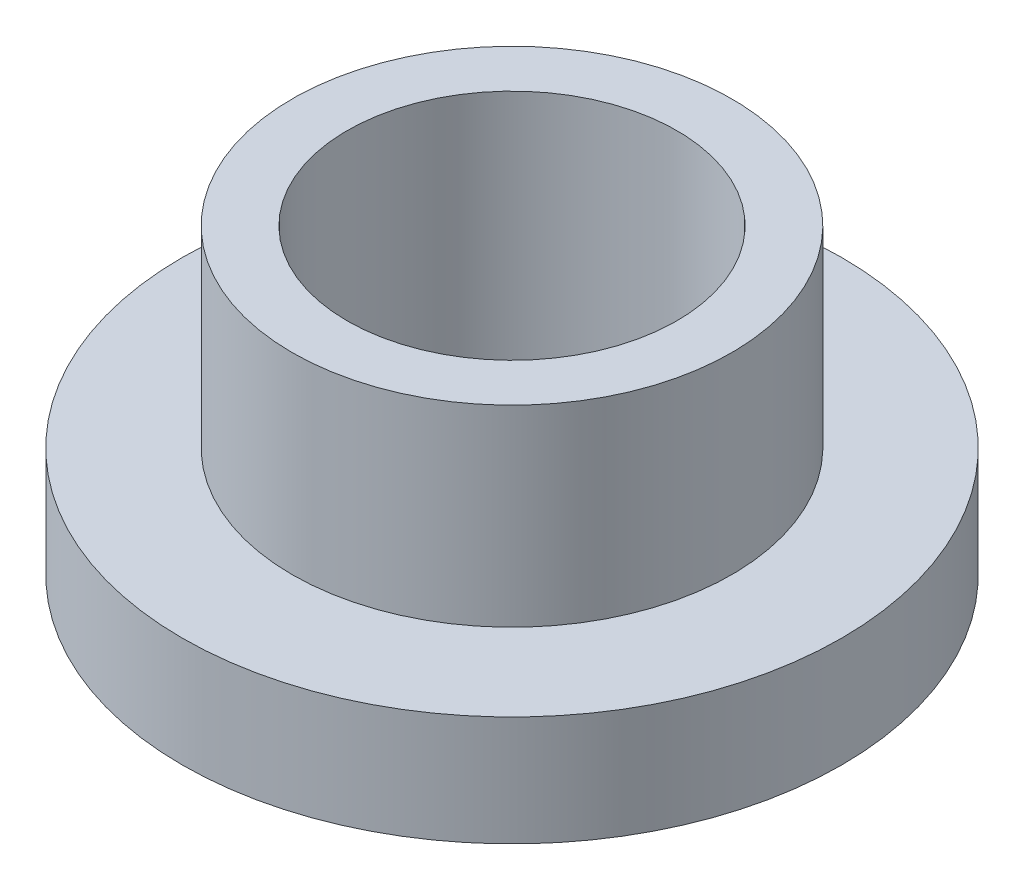
ISO-10303-21;
HEADER;
FILE_DESCRIPTION(('STEP AP214'),'2;1');
FILE_NAME('part.step','',(''),(''),'','','');
FILE_SCHEMA(('AUTOMOTIVE_DESIGN { 1 0 10303 214 1 1 1 1 }'));
ENDSEC;
DATA;
#1=APPLICATION_CONTEXT('core data for automotive mechanical design processes');
#2=APPLICATION_PROTOCOL_DEFINITION('international standard','automotive_design',2000,#1);
#3=PRODUCT_CONTEXT('',#1,'mechanical');
#4=PRODUCT('Part','Part','',(#3));
#5=PRODUCT_RELATED_PRODUCT_CATEGORY('part','',(#4));
#6=PRODUCT_DEFINITION_FORMATION('','',#4);
#7=PRODUCT_DEFINITION_CONTEXT('part definition',#1,'design');
#8=PRODUCT_DEFINITION('design','',#6,#7);
#9=PRODUCT_DEFINITION_SHAPE('','',#8);
#10=(LENGTH_UNIT() NAMED_UNIT(*) SI_UNIT(.MILLI.,.METRE.));
#11=(NAMED_UNIT(*) PLANE_ANGLE_UNIT() SI_UNIT($,.RADIAN.));
#12=(NAMED_UNIT(*) SI_UNIT($,.STERADIAN.) SOLID_ANGLE_UNIT());
#13=UNCERTAINTY_MEASURE_WITH_UNIT(LENGTH_MEASURE(1.E-05),#10,'distance_accuracy_value','');
#14=(GEOMETRIC_REPRESENTATION_CONTEXT(3) GLOBAL_UNCERTAINTY_ASSIGNED_CONTEXT((#13)) GLOBAL_UNIT_ASSIGNED_CONTEXT((#10,
#11,#12)) REPRESENTATION_CONTEXT('',''));
#15=CARTESIAN_POINT('',(0.,0.,0.));
#16=DIRECTION('',(0.,0.,1.));
#17=DIRECTION('',(1.,0.,0.));
#18=AXIS2_PLACEMENT_3D('',#15,#16,#17);
#19=CARTESIAN_POINT('',(0.,1.,0.));
#20=DIRECTION('',(0.,-1.,0.));
#21=DIRECTION('',(0.,0.,-1.));
#22=AXIS2_PLACEMENT_3D('',#19,#20,#21);
#23=CYLINDRICAL_SURFACE('',#22,6.);
#24=CARTESIAN_POINT('',(0.,1.,0.));
#25=DIRECTION('',(0.,1.,0.));
#26=DIRECTION('',(0.,0.,1.));
#27=AXIS2_PLACEMENT_3D('',#24,#25,#26);
#28=CIRCLE('',#27,6.);
#29=CARTESIAN_POINT('',(0.,1.,6.));
#30=VERTEX_POINT('',#29);
#31=EDGE_CURVE('E42',#30,#30,#28,.T.);
#32=ORIENTED_EDGE('',*,*,#31,.F.);
#33=EDGE_LOOP('',(#32));
#34=FACE_BOUND('',#33,.T.);
#35=CARTESIAN_POINT('',(0.,-1.,0.));
#36=DIRECTION('',(0.,1.,0.));
#37=DIRECTION('',(0.,0.,1.));
#38=AXIS2_PLACEMENT_3D('',#35,#36,#37);
#39=CIRCLE('',#38,6.);
#40=CARTESIAN_POINT('',(0.,-1.,6.));
#41=VERTEX_POINT('',#40);
#42=EDGE_CURVE('E37',#41,#41,#39,.T.);
#43=ORIENTED_EDGE('',*,*,#42,.T.);
#44=EDGE_LOOP('',(#43));
#45=FACE_BOUND('',#44,.T.);
#46=ADVANCED_FACE('F40',(#34,#45),#23,.T.);
#47=CARTESIAN_POINT('',(0.,1.,0.));
#48=DIRECTION('',(0.,1.,0.));
#49=DIRECTION('',(0.,0.,1.));
#50=AXIS2_PLACEMENT_3D('',#47,#48,#49);
#51=PLANE('',#50);
#52=CARTESIAN_POINT('',(0.,1.,0.));
#53=DIRECTION('',(0.,1.,0.));
#54=DIRECTION('',(0.,0.,1.));
#55=AXIS2_PLACEMENT_3D('',#52,#53,#54);
#56=CIRCLE('',#55,4.);
#57=CARTESIAN_POINT('',(0.,1.,4.));
#58=VERTEX_POINT('',#57);
#59=EDGE_CURVE('E10',#58,#58,#56,.T.);
#60=ORIENTED_EDGE('',*,*,#59,.F.);
#61=EDGE_LOOP('',(#60));
#62=FACE_BOUND('',#61,.T.);
#63=ORIENTED_EDGE('',*,*,#31,.T.);
#64=EDGE_LOOP('',(#63));
#65=FACE_BOUND('',#64,.T.);
#66=ADVANCED_FACE('F84',(#62,#65),#51,.T.);
#67=CARTESIAN_POINT('',(0.,-1.,0.));
#68=DIRECTION('',(0.,1.,0.));
#69=DIRECTION('',(0.,0.,1.));
#70=AXIS2_PLACEMENT_3D('',#67,#68,#69);
#71=PLANE('',#70);
#72=CARTESIAN_POINT('',(0.,-1.,0.));
#73=DIRECTION('',(0.,1.,0.));
#74=DIRECTION('',(0.,0.,1.));
#75=AXIS2_PLACEMENT_3D('',#72,#73,#74);
#76=CIRCLE('',#75,3.);
#77=CARTESIAN_POINT('',(0.,-1.,3.));
#78=VERTEX_POINT('',#77);
#79=EDGE_CURVE('E52',#78,#78,#76,.T.);
#80=ORIENTED_EDGE('',*,*,#79,.T.);
#81=EDGE_LOOP('',(#80));
#82=FACE_BOUND('',#81,.T.);
#83=ORIENTED_EDGE('',*,*,#42,.F.);
#84=EDGE_LOOP('',(#83));
#85=FACE_BOUND('',#84,.T.);
#86=ADVANCED_FACE('F58',(#82,#85),#71,.F.);
#87=CARTESIAN_POINT('',(0.,4.5,0.));
#88=DIRECTION('',(0.,-1.,0.));
#89=DIRECTION('',(0.,0.,-1.));
#90=AXIS2_PLACEMENT_3D('',#87,#88,#89);
#91=CYLINDRICAL_SURFACE('',#90,4.);
#92=CARTESIAN_POINT('',(0.,4.5,0.));
#93=DIRECTION('',(0.,1.,0.));
#94=DIRECTION('',(0.,0.,1.));
#95=AXIS2_PLACEMENT_3D('',#92,#93,#94);
#96=CIRCLE('',#95,4.);
#97=CARTESIAN_POINT('',(0.,4.5,4.));
#98=VERTEX_POINT('',#97);
#99=EDGE_CURVE('E49',#98,#98,#96,.T.);
#100=ORIENTED_EDGE('',*,*,#99,.F.);
#101=EDGE_LOOP('',(#100));
#102=FACE_BOUND('',#101,.T.);
#103=ORIENTED_EDGE('',*,*,#59,.T.);
#104=EDGE_LOOP('',(#103));
#105=FACE_BOUND('',#104,.T.);
#106=ADVANCED_FACE('F75',(#102,#105),#91,.T.);
#107=CARTESIAN_POINT('',(0.,4.5,0.));
#108=DIRECTION('',(0.,1.,0.));
#109=DIRECTION('',(0.,0.,1.));
#110=AXIS2_PLACEMENT_3D('',#107,#108,#109);
#111=PLANE('',#110);
#112=CARTESIAN_POINT('',(0.,4.5,0.));
#113=DIRECTION('',(0.,1.,0.));
#114=DIRECTION('',(0.,0.,1.));
#115=AXIS2_PLACEMENT_3D('',#112,#113,#114);
#116=CIRCLE('',#115,3.);
#117=CARTESIAN_POINT('',(0.,4.5,3.));
#118=VERTEX_POINT('',#117);
#119=EDGE_CURVE('E53',#118,#118,#116,.T.);
#120=ORIENTED_EDGE('',*,*,#119,.F.);
#121=EDGE_LOOP('',(#120));
#122=FACE_BOUND('',#121,.T.);
#123=ORIENTED_EDGE('',*,*,#99,.T.);
#124=EDGE_LOOP('',(#123));
#125=FACE_BOUND('',#124,.T.);
#126=ADVANCED_FACE('F67',(#122,#125),#111,.T.);
#127=CARTESIAN_POINT('',(0.,-1.,0.));
#128=DIRECTION('',(0.,1.,0.));
#129=DIRECTION('',(0.,0.,1.));
#130=AXIS2_PLACEMENT_3D('',#127,#128,#129);
#131=CYLINDRICAL_SURFACE('',#130,3.);
#132=ORIENTED_EDGE('',*,*,#79,.F.);
#133=EDGE_LOOP('',(#132));
#134=FACE_BOUND('',#133,.T.);
#135=ORIENTED_EDGE('',*,*,#119,.T.);
#136=EDGE_LOOP('',(#135));
#137=FACE_BOUND('',#136,.T.);
#138=ADVANCED_FACE('F64',(#134,#137),#131,.F.);
#139=CLOSED_SHELL('',(#46,#66,#86,#106,#126,#138));
#140=MANIFOLD_SOLID_BREP('B2',#139);
#141=ADVANCED_BREP_SHAPE_REPRESENTATION('',(#18,#140),#14);
#142=SHAPE_DEFINITION_REPRESENTATION(#9,#141);
ENDSEC;
END-ISO-10303-21;
